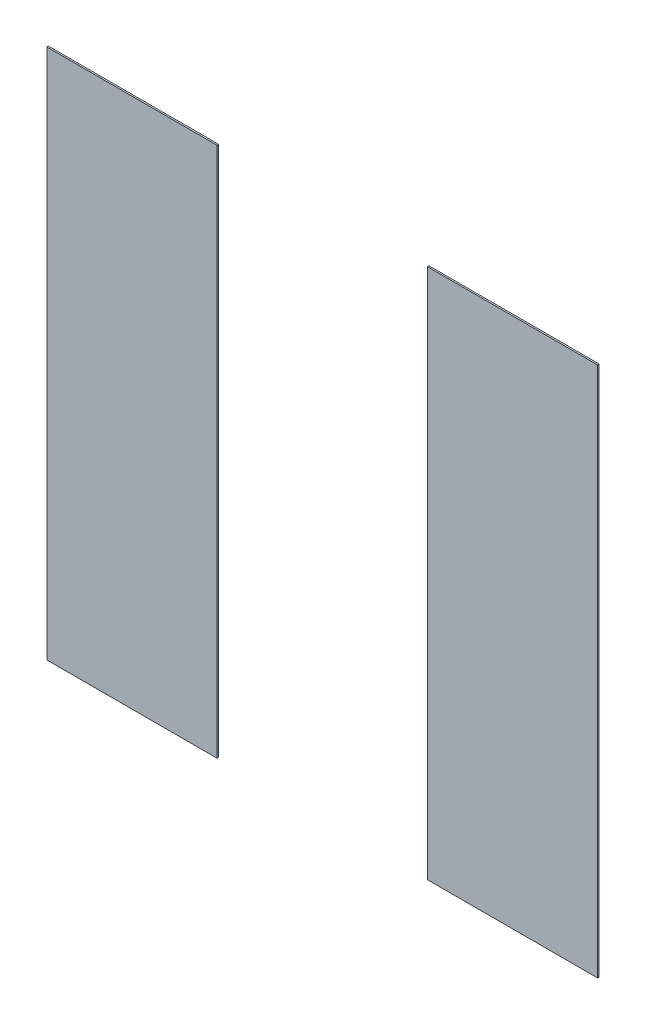
ISO-10303-21;
HEADER;
FILE_DESCRIPTION(('STEP AP214'),'2;1');
FILE_NAME('part.step','',(''),(''),'','','');
FILE_SCHEMA(('AUTOMOTIVE_DESIGN { 1 0 10303 214 1 1 1 1 }'));
ENDSEC;
DATA;
#1=APPLICATION_CONTEXT('core data for automotive mechanical design processes');
#2=APPLICATION_PROTOCOL_DEFINITION('international standard','automotive_design',2000,#1);
#3=PRODUCT_CONTEXT('',#1,'mechanical');
#4=PRODUCT('Part','Part','',(#3));
#5=PRODUCT_RELATED_PRODUCT_CATEGORY('part','',(#4));
#6=PRODUCT_DEFINITION_FORMATION('','',#4);
#7=PRODUCT_DEFINITION_CONTEXT('part definition',#1,'design');
#8=PRODUCT_DEFINITION('design','',#6,#7);
#9=PRODUCT_DEFINITION_SHAPE('','',#8);
#10=(LENGTH_UNIT() NAMED_UNIT(*) SI_UNIT(.MILLI.,.METRE.));
#11=(NAMED_UNIT(*) PLANE_ANGLE_UNIT() SI_UNIT($,.RADIAN.));
#12=(NAMED_UNIT(*) SI_UNIT($,.STERADIAN.) SOLID_ANGLE_UNIT());
#13=UNCERTAINTY_MEASURE_WITH_UNIT(LENGTH_MEASURE(1.E-05),#10,'distance_accuracy_value','');
#14=(GEOMETRIC_REPRESENTATION_CONTEXT(3) GLOBAL_UNCERTAINTY_ASSIGNED_CONTEXT((#13)) GLOBAL_UNIT_ASSIGNED_CONTEXT((#10,
#11,#12)) REPRESENTATION_CONTEXT('',''));
#15=CARTESIAN_POINT('',(0.,0.,0.));
#16=DIRECTION('',(0.,0.,1.));
#17=DIRECTION('',(1.,0.,0.));
#18=AXIS2_PLACEMENT_3D('',#15,#16,#17);
#19=CARTESIAN_POINT('',(3.4925,3.3655,0.02));
#20=DIRECTION('',(-1.,0.,0.));
#21=DIRECTION('',(0.,-1.,0.));
#22=AXIS2_PLACEMENT_3D('',#19,#20,#21);
#23=PLANE('',#22);
#24=DIRECTION('',(0.,1.,0.));
#25=VECTOR('',#24,1.);
#26=CARTESIAN_POINT('',(3.4925,3.3655,0.));
#27=LINE('',#26,#25);
#28=CARTESIAN_POINT('',(3.4925,-3.3655,0.));
#29=VERTEX_POINT('',#28);
#30=CARTESIAN_POINT('',(3.4925,3.3655,0.));
#31=VERTEX_POINT('',#30);
#32=EDGE_CURVE('E103',#29,#31,#27,.T.);
#33=ORIENTED_EDGE('',*,*,#32,.T.);
#34=DIRECTION('',(0.,0.,-1.));
#35=VECTOR('',#34,1.);
#36=CARTESIAN_POINT('',(3.4925,3.3655,0.02));
#37=LINE('',#36,#35);
#38=CARTESIAN_POINT('',(3.4925,3.3655,0.02));
#39=VERTEX_POINT('',#38);
#40=EDGE_CURVE('E12',#39,#31,#37,.T.);
#41=ORIENTED_EDGE('',*,*,#40,.F.);
#42=DIRECTION('',(0.,1.,0.));
#43=VECTOR('',#42,1.);
#44=CARTESIAN_POINT('',(3.4925,3.3655,0.02));
#45=LINE('',#44,#43);
#46=CARTESIAN_POINT('',(3.4925,-3.3655,0.02));
#47=VERTEX_POINT('',#46);
#48=EDGE_CURVE('E91',#47,#39,#45,.T.);
#49=ORIENTED_EDGE('',*,*,#48,.F.);
#50=DIRECTION('',(0.,0.,-1.));
#51=VECTOR('',#50,1.);
#52=CARTESIAN_POINT('',(3.4925,-3.3655,0.02));
#53=LINE('',#52,#51);
#54=EDGE_CURVE('E99',#47,#29,#53,.T.);
#55=ORIENTED_EDGE('',*,*,#54,.T.);
#56=EDGE_LOOP('',(#33,#41,#49,#55));
#57=FACE_BOUND('',#56,.T.);
#58=ADVANCED_FACE('F40',(#57),#23,.F.);
#59=CARTESIAN_POINT('',(1.3335,3.3655,0.02));
#60=DIRECTION('',(0.,-1.,0.));
#61=DIRECTION('',(0.,0.,-1.));
#62=AXIS2_PLACEMENT_3D('',#59,#60,#61);
#63=PLANE('',#62);
#64=DIRECTION('',(-1.,0.,0.));
#65=VECTOR('',#64,1.);
#66=CARTESIAN_POINT('',(1.3335,3.3655,0.));
#67=LINE('',#66,#65);
#68=CARTESIAN_POINT('',(1.3335,3.3655,0.));
#69=VERTEX_POINT('',#68);
#70=EDGE_CURVE('E95',#31,#69,#67,.T.);
#71=ORIENTED_EDGE('',*,*,#70,.T.);
#72=DIRECTION('',(0.,0.,-1.));
#73=VECTOR('',#72,1.);
#74=CARTESIAN_POINT('',(1.3335,3.3655,0.02));
#75=LINE('',#74,#73);
#76=CARTESIAN_POINT('',(1.3335,3.3655,0.02));
#77=VERTEX_POINT('',#76);
#78=EDGE_CURVE('E48',#77,#69,#75,.T.);
#79=ORIENTED_EDGE('',*,*,#78,.F.);
#80=DIRECTION('',(-1.,0.,0.));
#81=VECTOR('',#80,1.);
#82=CARTESIAN_POINT('',(1.3335,3.3655,0.02));
#83=LINE('',#82,#81);
#84=EDGE_CURVE('E86',#39,#77,#83,.T.);
#85=ORIENTED_EDGE('',*,*,#84,.F.);
#86=ORIENTED_EDGE('',*,*,#40,.T.);
#87=EDGE_LOOP('',(#71,#79,#85,#86));
#88=FACE_BOUND('',#87,.T.);
#89=ADVANCED_FACE('F94',(#88),#63,.F.);
#90=CARTESIAN_POINT('',(1.3335,3.3655,0.02));
#91=DIRECTION('',(1.,0.,0.));
#92=DIRECTION('',(0.,0.,-1.));
#93=AXIS2_PLACEMENT_3D('',#90,#91,#92);
#94=PLANE('',#93);
#95=DIRECTION('',(0.,-1.,0.));
#96=VECTOR('',#95,1.);
#97=CARTESIAN_POINT('',(1.3335,3.3655,0.));
#98=LINE('',#97,#96);
#99=CARTESIAN_POINT('',(1.3335,-3.3655,0.));
#100=VERTEX_POINT('',#99);
#101=EDGE_CURVE('E73',#69,#100,#98,.T.);
#102=ORIENTED_EDGE('',*,*,#101,.T.);
#103=DIRECTION('',(0.,0.,-1.));
#104=VECTOR('',#103,1.);
#105=CARTESIAN_POINT('',(1.3335,-3.3655,0.02));
#106=LINE('',#105,#104);
#107=CARTESIAN_POINT('',(1.3335,-3.3655,0.02));
#108=VERTEX_POINT('',#107);
#109=EDGE_CURVE('E96',#108,#100,#106,.T.);
#110=ORIENTED_EDGE('',*,*,#109,.F.);
#111=DIRECTION('',(0.,-1.,0.));
#112=VECTOR('',#111,1.);
#113=CARTESIAN_POINT('',(1.3335,3.3655,0.02));
#114=LINE('',#113,#112);
#115=EDGE_CURVE('E89',#77,#108,#114,.T.);
#116=ORIENTED_EDGE('',*,*,#115,.F.);
#117=ORIENTED_EDGE('',*,*,#78,.T.);
#118=EDGE_LOOP('',(#102,#110,#116,#117));
#119=FACE_BOUND('',#118,.T.);
#120=ADVANCED_FACE('F97',(#119),#94,.F.);
#121=CARTESIAN_POINT('',(1.3335,-3.3655,0.02));
#122=DIRECTION('',(0.,1.,0.));
#123=DIRECTION('',(0.,0.,1.));
#124=AXIS2_PLACEMENT_3D('',#121,#122,#123);
#125=PLANE('',#124);
#126=DIRECTION('',(1.,0.,0.));
#127=VECTOR('',#126,1.);
#128=CARTESIAN_POINT('',(1.3335,-3.3655,0.));
#129=LINE('',#128,#127);
#130=EDGE_CURVE('E79',#100,#29,#129,.T.);
#131=ORIENTED_EDGE('',*,*,#130,.T.);
#132=ORIENTED_EDGE('',*,*,#54,.F.);
#133=DIRECTION('',(1.,0.,0.));
#134=VECTOR('',#133,1.);
#135=CARTESIAN_POINT('',(1.3335,-3.3655,0.02));
#136=LINE('',#135,#134);
#137=EDGE_CURVE('E56',#108,#47,#136,.T.);
#138=ORIENTED_EDGE('',*,*,#137,.F.);
#139=ORIENTED_EDGE('',*,*,#109,.T.);
#140=EDGE_LOOP('',(#131,#132,#138,#139));
#141=FACE_BOUND('',#140,.T.);
#142=ADVANCED_FACE('F110',(#141),#125,.F.);
#143=CARTESIAN_POINT('',(3.4925,-3.3655,0.02));
#144=DIRECTION('',(0.,0.,1.));
#145=DIRECTION('',(1.,0.,0.));
#146=AXIS2_PLACEMENT_3D('',#143,#144,#145);
#147=PLANE('',#146);
#148=ORIENTED_EDGE('',*,*,#48,.T.);
#149=ORIENTED_EDGE('',*,*,#84,.T.);
#150=ORIENTED_EDGE('',*,*,#115,.T.);
#151=ORIENTED_EDGE('',*,*,#137,.T.);
#152=EDGE_LOOP('',(#148,#149,#150,#151));
#153=FACE_BOUND('',#152,.T.);
#154=ADVANCED_FACE('F87',(#153),#147,.T.);
#155=CARTESIAN_POINT('',(3.4925,-3.3655,0.));
#156=DIRECTION('',(0.,0.,1.));
#157=DIRECTION('',(1.,0.,0.));
#158=AXIS2_PLACEMENT_3D('',#155,#156,#157);
#159=PLANE('',#158);
#160=ORIENTED_EDGE('',*,*,#32,.F.);
#161=ORIENTED_EDGE('',*,*,#130,.F.);
#162=ORIENTED_EDGE('',*,*,#101,.F.);
#163=ORIENTED_EDGE('',*,*,#70,.F.);
#164=EDGE_LOOP('',(#160,#161,#162,#163));
#165=FACE_BOUND('',#164,.T.);
#166=ADVANCED_FACE('F113',(#165),#159,.F.);
#167=CLOSED_SHELL('',(#58,#89,#120,#142,#154,#166));
#168=MANIFOLD_SOLID_BREP('B2',#167);
#169=CARTESIAN_POINT('',(-1.3335,3.3655,0.02));
#170=DIRECTION('',(-1.,0.,0.));
#171=DIRECTION('',(0.,-1.,0.));
#172=AXIS2_PLACEMENT_3D('',#169,#170,#171);
#173=PLANE('',#172);
#174=DIRECTION('',(0.,1.,0.));
#175=VECTOR('',#174,1.);
#176=CARTESIAN_POINT('',(-1.3335,3.3655,0.));
#177=LINE('',#176,#175);
#178=CARTESIAN_POINT('',(-1.3335,-3.3655,0.));
#179=VERTEX_POINT('',#178);
#180=CARTESIAN_POINT('',(-1.3335,3.3655,0.));
#181=VERTEX_POINT('',#180);
#182=EDGE_CURVE('E226',#179,#181,#177,.T.);
#183=ORIENTED_EDGE('',*,*,#182,.T.);
#184=DIRECTION('',(0.,0.,-1.));
#185=VECTOR('',#184,1.);
#186=CARTESIAN_POINT('',(-1.3335,3.3655,0.02));
#187=LINE('',#186,#185);
#188=CARTESIAN_POINT('',(-1.3335,3.3655,0.02));
#189=VERTEX_POINT('',#188);
#190=EDGE_CURVE('E38',#189,#181,#187,.T.);
#191=ORIENTED_EDGE('',*,*,#190,.F.);
#192=DIRECTION('',(0.,1.,0.));
#193=VECTOR('',#192,1.);
#194=CARTESIAN_POINT('',(-1.3335,3.3655,0.02));
#195=LINE('',#194,#193);
#196=CARTESIAN_POINT('',(-1.3335,-3.3655,0.02));
#197=VERTEX_POINT('',#196);
#198=EDGE_CURVE('E214',#197,#189,#195,.T.);
#199=ORIENTED_EDGE('',*,*,#198,.F.);
#200=DIRECTION('',(0.,0.,-1.));
#201=VECTOR('',#200,1.);
#202=CARTESIAN_POINT('',(-1.3335,-3.3655,0.02));
#203=LINE('',#202,#201);
#204=EDGE_CURVE('E222',#197,#179,#203,.T.);
#205=ORIENTED_EDGE('',*,*,#204,.T.);
#206=EDGE_LOOP('',(#183,#191,#199,#205));
#207=FACE_BOUND('',#206,.T.);
#208=ADVANCED_FACE('F163',(#207),#173,.F.);
#209=CARTESIAN_POINT('',(-3.4925,3.3655,0.02));
#210=DIRECTION('',(0.,-1.,0.));
#211=DIRECTION('',(0.,0.,-1.));
#212=AXIS2_PLACEMENT_3D('',#209,#210,#211);
#213=PLANE('',#212);
#214=DIRECTION('',(-1.,0.,0.));
#215=VECTOR('',#214,1.);
#216=CARTESIAN_POINT('',(-3.4925,3.3655,0.));
#217=LINE('',#216,#215);
#218=CARTESIAN_POINT('',(-3.4925,3.3655,0.));
#219=VERTEX_POINT('',#218);
#220=EDGE_CURVE('E218',#181,#219,#217,.T.);
#221=ORIENTED_EDGE('',*,*,#220,.T.);
#222=DIRECTION('',(0.,0.,-1.));
#223=VECTOR('',#222,1.);
#224=CARTESIAN_POINT('',(-3.4925,3.3655,0.02));
#225=LINE('',#224,#223);
#226=CARTESIAN_POINT('',(-3.4925,3.3655,0.02));
#227=VERTEX_POINT('',#226);
#228=EDGE_CURVE('E171',#227,#219,#225,.T.);
#229=ORIENTED_EDGE('',*,*,#228,.F.);
#230=DIRECTION('',(-1.,0.,0.));
#231=VECTOR('',#230,1.);
#232=CARTESIAN_POINT('',(-3.4925,3.3655,0.02));
#233=LINE('',#232,#231);
#234=EDGE_CURVE('E209',#189,#227,#233,.T.);
#235=ORIENTED_EDGE('',*,*,#234,.F.);
#236=ORIENTED_EDGE('',*,*,#190,.T.);
#237=EDGE_LOOP('',(#221,#229,#235,#236));
#238=FACE_BOUND('',#237,.T.);
#239=ADVANCED_FACE('F217',(#238),#213,.F.);
#240=CARTESIAN_POINT('',(-3.4925,3.3655,0.02));
#241=DIRECTION('',(1.,0.,0.));
#242=DIRECTION('',(0.,0.,-1.));
#243=AXIS2_PLACEMENT_3D('',#240,#241,#242);
#244=PLANE('',#243);
#245=DIRECTION('',(0.,-1.,0.));
#246=VECTOR('',#245,1.);
#247=CARTESIAN_POINT('',(-3.4925,3.3655,0.));
#248=LINE('',#247,#246);
#249=CARTESIAN_POINT('',(-3.4925,-3.3655,0.));
#250=VERTEX_POINT('',#249);
#251=EDGE_CURVE('E196',#219,#250,#248,.T.);
#252=ORIENTED_EDGE('',*,*,#251,.T.);
#253=DIRECTION('',(0.,0.,-1.));
#254=VECTOR('',#253,1.);
#255=CARTESIAN_POINT('',(-3.4925,-3.3655,0.02));
#256=LINE('',#255,#254);
#257=CARTESIAN_POINT('',(-3.4925,-3.3655,0.02));
#258=VERTEX_POINT('',#257);
#259=EDGE_CURVE('E219',#258,#250,#256,.T.);
#260=ORIENTED_EDGE('',*,*,#259,.F.);
#261=DIRECTION('',(0.,-1.,0.));
#262=VECTOR('',#261,1.);
#263=CARTESIAN_POINT('',(-3.4925,3.3655,0.02));
#264=LINE('',#263,#262);
#265=EDGE_CURVE('E212',#227,#258,#264,.T.);
#266=ORIENTED_EDGE('',*,*,#265,.F.);
#267=ORIENTED_EDGE('',*,*,#228,.T.);
#268=EDGE_LOOP('',(#252,#260,#266,#267));
#269=FACE_BOUND('',#268,.T.);
#270=ADVANCED_FACE('F220',(#269),#244,.F.);
#271=CARTESIAN_POINT('',(-3.4925,-3.3655,0.02));
#272=DIRECTION('',(0.,1.,0.));
#273=DIRECTION('',(-1.,0.,0.));
#274=AXIS2_PLACEMENT_3D('',#271,#272,#273);
#275=PLANE('',#274);
#276=DIRECTION('',(1.,0.,0.));
#277=VECTOR('',#276,1.);
#278=CARTESIAN_POINT('',(-3.4925,-3.3655,0.));
#279=LINE('',#278,#277);
#280=EDGE_CURVE('E202',#250,#179,#279,.T.);
#281=ORIENTED_EDGE('',*,*,#280,.T.);
#282=ORIENTED_EDGE('',*,*,#204,.F.);
#283=DIRECTION('',(1.,0.,0.));
#284=VECTOR('',#283,1.);
#285=CARTESIAN_POINT('',(-3.4925,-3.3655,0.02));
#286=LINE('',#285,#284);
#287=EDGE_CURVE('E179',#258,#197,#286,.T.);
#288=ORIENTED_EDGE('',*,*,#287,.F.);
#289=ORIENTED_EDGE('',*,*,#259,.T.);
#290=EDGE_LOOP('',(#281,#282,#288,#289));
#291=FACE_BOUND('',#290,.T.);
#292=ADVANCED_FACE('F233',(#291),#275,.F.);
#293=CARTESIAN_POINT('',(-1.3335,-3.3655,0.02));
#294=DIRECTION('',(0.,0.,1.));
#295=DIRECTION('',(1.,0.,0.));
#296=AXIS2_PLACEMENT_3D('',#293,#294,#295);
#297=PLANE('',#296);
#298=ORIENTED_EDGE('',*,*,#198,.T.);
#299=ORIENTED_EDGE('',*,*,#234,.T.);
#300=ORIENTED_EDGE('',*,*,#265,.T.);
#301=ORIENTED_EDGE('',*,*,#287,.T.);
#302=EDGE_LOOP('',(#298,#299,#300,#301));
#303=FACE_BOUND('',#302,.T.);
#304=ADVANCED_FACE('F210',(#303),#297,.T.);
#305=CARTESIAN_POINT('',(-1.3335,-3.3655,0.));
#306=DIRECTION('',(0.,0.,1.));
#307=DIRECTION('',(1.,0.,0.));
#308=AXIS2_PLACEMENT_3D('',#305,#306,#307);
#309=PLANE('',#308);
#310=ORIENTED_EDGE('',*,*,#182,.F.);
#311=ORIENTED_EDGE('',*,*,#280,.F.);
#312=ORIENTED_EDGE('',*,*,#251,.F.);
#313=ORIENTED_EDGE('',*,*,#220,.F.);
#314=EDGE_LOOP('',(#310,#311,#312,#313));
#315=FACE_BOUND('',#314,.T.);
#316=ADVANCED_FACE('F236',(#315),#309,.F.);
#317=CLOSED_SHELL('',(#208,#239,#270,#292,#304,#316));
#318=MANIFOLD_SOLID_BREP('B6',#317);
#319=ADVANCED_BREP_SHAPE_REPRESENTATION('',(#18,#168,#318),#14);
#320=SHAPE_DEFINITION_REPRESENTATION(#9,#319);
ENDSEC;
END-ISO-10303-21;
